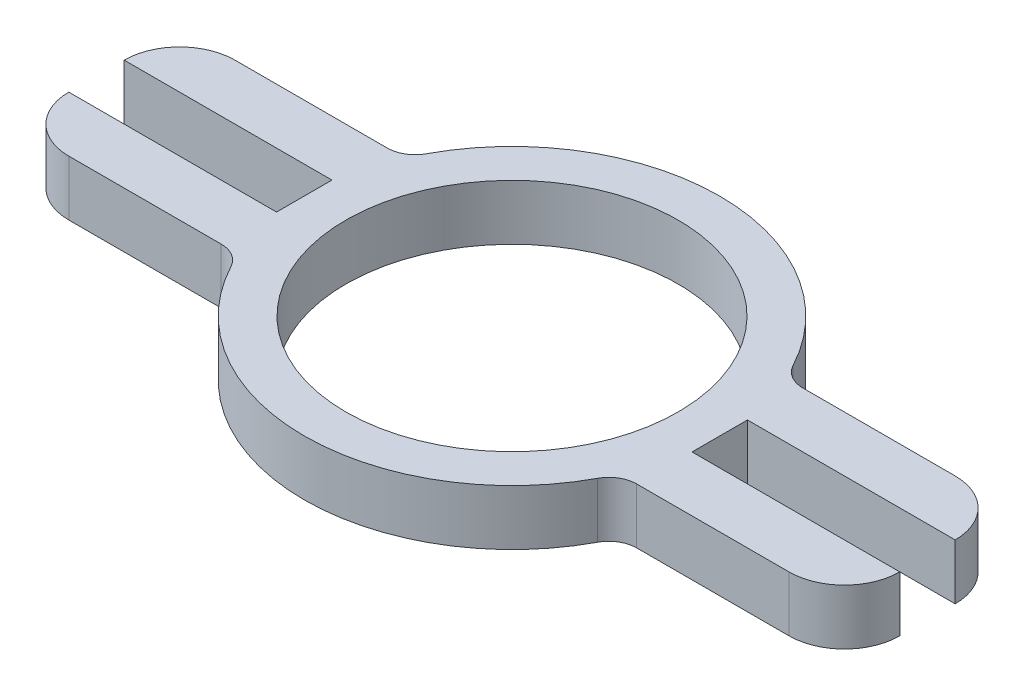
ISO-10303-21;
HEADER;
FILE_DESCRIPTION(('STEP AP214'),'2;1');
FILE_NAME('part.step','',(''),(''),'','','');
FILE_SCHEMA(('AUTOMOTIVE_DESIGN { 1 0 10303 214 1 1 1 1 }'));
ENDSEC;
DATA;
#1=APPLICATION_CONTEXT('core data for automotive mechanical design processes');
#2=APPLICATION_PROTOCOL_DEFINITION('international standard','automotive_design',2000,#1);
#3=PRODUCT_CONTEXT('',#1,'mechanical');
#4=PRODUCT('Part','Part','',(#3));
#5=PRODUCT_RELATED_PRODUCT_CATEGORY('part','',(#4));
#6=PRODUCT_DEFINITION_FORMATION('','',#4);
#7=PRODUCT_DEFINITION_CONTEXT('part definition',#1,'design');
#8=PRODUCT_DEFINITION('design','',#6,#7);
#9=PRODUCT_DEFINITION_SHAPE('','',#8);
#10=(LENGTH_UNIT() NAMED_UNIT(*) SI_UNIT(.MILLI.,.METRE.));
#11=(NAMED_UNIT(*) PLANE_ANGLE_UNIT() SI_UNIT($,.RADIAN.));
#12=(NAMED_UNIT(*) SI_UNIT($,.STERADIAN.) SOLID_ANGLE_UNIT());
#13=UNCERTAINTY_MEASURE_WITH_UNIT(LENGTH_MEASURE(1.E-05),#10,'distance_accuracy_value','');
#14=(GEOMETRIC_REPRESENTATION_CONTEXT(3) GLOBAL_UNCERTAINTY_ASSIGNED_CONTEXT((#13)) GLOBAL_UNIT_ASSIGNED_CONTEXT((#10,
#11,#12)) REPRESENTATION_CONTEXT('',''));
#15=CARTESIAN_POINT('',(0.,0.,0.));
#16=DIRECTION('',(0.,0.,1.));
#17=DIRECTION('',(1.,0.,0.));
#18=AXIS2_PLACEMENT_3D('',#15,#16,#17);
#19=CARTESIAN_POINT('',(0.,20.,0.));
#20=DIRECTION('',(0.,-1.,0.));
#21=DIRECTION('',(0.,0.,-1.));
#22=AXIS2_PLACEMENT_3D('',#19,#20,#21);
#23=CYLINDRICAL_SURFACE('',#22,75.);
#24=CARTESIAN_POINT('',(0.,20.,0.));
#25=DIRECTION('',(0.,1.,0.));
#26=DIRECTION('',(0.,0.,1.));
#27=AXIS2_PLACEMENT_3D('',#24,#25,#26);
#28=CIRCLE('',#27,75.);
#29=CARTESIAN_POINT('',(66.1764705882353,20.,-35.2941176470588));
#30=VERTEX_POINT('',#29);
#31=CARTESIAN_POINT('',(-66.1764705882353,20.,-35.2941176470588));
#32=VERTEX_POINT('',#31);
#33=EDGE_CURVE('E287',#30,#32,#28,.T.);
#34=ORIENTED_EDGE('',*,*,#33,.F.);
#35=DIRECTION('',(0.,-1.,0.));
#36=VECTOR('',#35,1.);
#37=CARTESIAN_POINT('',(66.1764705882353,20.,-35.2941176470588));
#38=LINE('',#37,#36);
#39=CARTESIAN_POINT('',(66.1764705882353,0.,-35.2941176470588));
#40=VERTEX_POINT('',#39);
#41=EDGE_CURVE('E333',#30,#40,#38,.T.);
#42=ORIENTED_EDGE('',*,*,#41,.T.);
#43=CARTESIAN_POINT('',(0.,0.,0.));
#44=DIRECTION('',(0.,1.,0.));
#45=DIRECTION('',(0.,0.,1.));
#46=AXIS2_PLACEMENT_3D('',#43,#44,#45);
#47=CIRCLE('',#46,75.);
#48=CARTESIAN_POINT('',(-66.1764705882353,0.,-35.2941176470588));
#49=VERTEX_POINT('',#48);
#50=EDGE_CURVE('E280',#40,#49,#47,.T.);
#51=ORIENTED_EDGE('',*,*,#50,.T.);
#52=DIRECTION('',(0.,-1.,0.));
#53=VECTOR('',#52,1.);
#54=CARTESIAN_POINT('',(-66.1764705882353,20.,-35.2941176470588));
#55=LINE('',#54,#53);
#56=EDGE_CURVE('E330',#49,#32,#55,.F.);
#57=ORIENTED_EDGE('',*,*,#56,.T.);
#58=EDGE_LOOP('',(#34,#42,#51,#57));
#59=FACE_BOUND('',#58,.T.);
#60=ADVANCED_FACE('F45',(#59),#23,.T.);
#61=CARTESIAN_POINT('',(0.,20.,0.));
#62=DIRECTION('',(0.,-1.,0.));
#63=DIRECTION('',(0.,0.,-1.));
#64=AXIS2_PLACEMENT_3D('',#61,#62,#63);
#65=CYLINDRICAL_SURFACE('',#64,75.);
#66=CARTESIAN_POINT('',(0.,20.,0.));
#67=DIRECTION('',(0.,1.,0.));
#68=DIRECTION('',(0.,0.,1.));
#69=AXIS2_PLACEMENT_3D('',#66,#67,#68);
#70=CIRCLE('',#69,75.);
#71=CARTESIAN_POINT('',(-66.1764705882353,20.,35.2941176470588));
#72=VERTEX_POINT('',#71);
#73=CARTESIAN_POINT('',(66.1764705882353,20.,35.2941176470588));
#74=VERTEX_POINT('',#73);
#75=EDGE_CURVE('E291',#72,#74,#70,.T.);
#76=ORIENTED_EDGE('',*,*,#75,.F.);
#77=DIRECTION('',(0.,-1.,0.));
#78=VECTOR('',#77,1.);
#79=CARTESIAN_POINT('',(-66.1764705882353,20.,35.2941176470588));
#80=LINE('',#79,#78);
#81=CARTESIAN_POINT('',(-66.1764705882353,0.,35.2941176470588));
#82=VERTEX_POINT('',#81);
#83=EDGE_CURVE('E319',#72,#82,#80,.T.);
#84=ORIENTED_EDGE('',*,*,#83,.T.);
#85=CARTESIAN_POINT('',(0.,0.,0.));
#86=DIRECTION('',(0.,1.,0.));
#87=DIRECTION('',(0.,0.,1.));
#88=AXIS2_PLACEMENT_3D('',#85,#86,#87);
#89=CIRCLE('',#88,75.);
#90=CARTESIAN_POINT('',(66.1764705882353,0.,35.2941176470588));
#91=VERTEX_POINT('',#90);
#92=EDGE_CURVE('E307',#82,#91,#89,.T.);
#93=ORIENTED_EDGE('',*,*,#92,.T.);
#94=DIRECTION('',(0.,-1.,0.));
#95=VECTOR('',#94,1.);
#96=CARTESIAN_POINT('',(66.1764705882353,20.,35.2941176470588));
#97=LINE('',#96,#95);
#98=EDGE_CURVE('E303',#91,#74,#97,.F.);
#99=ORIENTED_EDGE('',*,*,#98,.T.);
#100=EDGE_LOOP('',(#76,#84,#93,#99));
#101=FACE_BOUND('',#100,.T.);
#102=ADVANCED_FACE('F449',(#101),#65,.T.);
#103=CARTESIAN_POINT('',(150.,20.,30.));
#104=DIRECTION('',(0.,0.,-1.));
#105=DIRECTION('',(-1.,0.,0.));
#106=AXIS2_PLACEMENT_3D('',#103,#104,#105);
#107=PLANE('',#106);
#108=DIRECTION('',(1.,0.,0.));
#109=VECTOR('',#108,1.);
#110=CARTESIAN_POINT('',(150.,0.,30.));
#111=LINE('',#110,#109);
#112=CARTESIAN_POINT('',(75.,0.,30.));
#113=VERTEX_POINT('',#112);
#114=CARTESIAN_POINT('',(130.,0.,30.));
#115=VERTEX_POINT('',#114);
#116=EDGE_CURVE('E311',#113,#115,#111,.T.);
#117=ORIENTED_EDGE('',*,*,#116,.T.);
#118=DIRECTION('',(0.,-1.,0.));
#119=VECTOR('',#118,1.);
#120=CARTESIAN_POINT('',(130.,20.,30.));
#121=LINE('',#120,#119);
#122=CARTESIAN_POINT('',(130.,20.,30.));
#123=VERTEX_POINT('',#122);
#124=EDGE_CURVE('E11',#115,#123,#121,.F.);
#125=ORIENTED_EDGE('',*,*,#124,.T.);
#126=DIRECTION('',(1.,0.,0.));
#127=VECTOR('',#126,1.);
#128=CARTESIAN_POINT('',(150.,20.,30.));
#129=LINE('',#128,#127);
#130=CARTESIAN_POINT('',(75.,20.,30.));
#131=VERTEX_POINT('',#130);
#132=EDGE_CURVE('E296',#131,#123,#129,.T.);
#133=ORIENTED_EDGE('',*,*,#132,.F.);
#134=DIRECTION('',(0.,1.,0.));
#135=VECTOR('',#134,1.);
#136=CARTESIAN_POINT('',(75.,0.,30.));
#137=LINE('',#136,#135);
#138=EDGE_CURVE('E326',#131,#113,#137,.F.);
#139=ORIENTED_EDGE('',*,*,#138,.T.);
#140=EDGE_LOOP('',(#117,#125,#133,#139));
#141=FACE_BOUND('',#140,.T.);
#142=ADVANCED_FACE('F458',(#141),#107,.F.);
#143=CARTESIAN_POINT('',(68.7386354243376,20.,-30.));
#144=DIRECTION('',(0.,0.,1.));
#145=DIRECTION('',(1.,0.,0.));
#146=AXIS2_PLACEMENT_3D('',#143,#144,#145);
#147=PLANE('',#146);
#148=DIRECTION('',(-1.,0.,0.));
#149=VECTOR('',#148,1.);
#150=CARTESIAN_POINT('',(68.7386354243376,20.,-30.));
#151=LINE('',#150,#149);
#152=CARTESIAN_POINT('',(130.,20.,-30.));
#153=VERTEX_POINT('',#152);
#154=CARTESIAN_POINT('',(75.,20.,-30.));
#155=VERTEX_POINT('',#154);
#156=EDGE_CURVE('E300',#153,#155,#151,.T.);
#157=ORIENTED_EDGE('',*,*,#156,.F.);
#158=DIRECTION('',(0.,-1.,0.));
#159=VECTOR('',#158,1.);
#160=CARTESIAN_POINT('',(130.,20.,-30.));
#161=LINE('',#160,#159);
#162=CARTESIAN_POINT('',(130.,0.,-30.));
#163=VERTEX_POINT('',#162);
#164=EDGE_CURVE('E54',#153,#163,#161,.T.);
#165=ORIENTED_EDGE('',*,*,#164,.T.);
#166=DIRECTION('',(-1.,0.,0.));
#167=VECTOR('',#166,1.);
#168=CARTESIAN_POINT('',(68.7386354243376,0.,-30.));
#169=LINE('',#168,#167);
#170=CARTESIAN_POINT('',(75.,0.,-30.));
#171=VERTEX_POINT('',#170);
#172=EDGE_CURVE('E292',#163,#171,#169,.T.);
#173=ORIENTED_EDGE('',*,*,#172,.T.);
#174=DIRECTION('',(0.,1.,0.));
#175=VECTOR('',#174,1.);
#176=CARTESIAN_POINT('',(75.,20.,-30.));
#177=LINE('',#176,#175);
#178=EDGE_CURVE('E337',#171,#155,#177,.T.);
#179=ORIENTED_EDGE('',*,*,#178,.T.);
#180=EDGE_LOOP('',(#157,#165,#173,#179));
#181=FACE_BOUND('',#180,.T.);
#182=ADVANCED_FACE('F403',(#181),#147,.F.);
#183=CARTESIAN_POINT('',(0.,20.,0.));
#184=DIRECTION('',(0.,1.,0.));
#185=DIRECTION('',(0.,0.,1.));
#186=AXIS2_PLACEMENT_3D('',#183,#184,#185);
#187=PLANE('',#186);
#188=DIRECTION('',(-1.,0.,0.));
#189=VECTOR('',#188,1.);
#190=CARTESIAN_POINT('',(-150.,20.,10.));
#191=LINE('',#190,#189);
#192=CARTESIAN_POINT('',(-75.,20.,10.));
#193=VERTEX_POINT('',#192);
#194=CARTESIAN_POINT('',(-150.,20.,10.));
#195=VERTEX_POINT('',#194);
#196=EDGE_CURVE('E197',#193,#195,#191,.T.);
#197=ORIENTED_EDGE('',*,*,#196,.T.);
#198=CARTESIAN_POINT('',(-130.,20.,10.));
#199=DIRECTION('',(0.,1.,0.));
#200=DIRECTION('',(0.,0.,1.));
#201=AXIS2_PLACEMENT_3D('',#198,#199,#200);
#202=CIRCLE('',#201,20.);
#203=CARTESIAN_POINT('',(-130.,20.,30.));
#204=VERTEX_POINT('',#203);
#205=EDGE_CURVE('E394',#195,#204,#202,.T.);
#206=ORIENTED_EDGE('',*,*,#205,.T.);
#207=DIRECTION('',(-1.,0.,0.));
#208=VECTOR('',#207,1.);
#209=CARTESIAN_POINT('',(-150.,20.,30.));
#210=LINE('',#209,#208);
#211=CARTESIAN_POINT('',(-75.,20.,30.));
#212=VERTEX_POINT('',#211);
#213=EDGE_CURVE('E231',#212,#204,#210,.T.);
#214=ORIENTED_EDGE('',*,*,#213,.F.);
#215=CARTESIAN_POINT('',(-75.,20.,40.));
#216=DIRECTION('',(0.,1.,0.));
#217=DIRECTION('',(0.,0.,1.));
#218=AXIS2_PLACEMENT_3D('',#215,#216,#217);
#219=CIRCLE('',#218,10.);
#220=EDGE_CURVE('E348',#212,#72,#219,.F.);
#221=ORIENTED_EDGE('',*,*,#220,.T.);
#222=ORIENTED_EDGE('',*,*,#75,.T.);
#223=CARTESIAN_POINT('',(75.,20.,40.));
#224=DIRECTION('',(0.,1.,0.));
#225=DIRECTION('',(0.,0.,1.));
#226=AXIS2_PLACEMENT_3D('',#223,#224,#225);
#227=CIRCLE('',#226,10.);
#228=EDGE_CURVE('E354',#74,#131,#227,.F.);
#229=ORIENTED_EDGE('',*,*,#228,.T.);
#230=ORIENTED_EDGE('',*,*,#132,.T.);
#231=CARTESIAN_POINT('',(130.,20.,9.99999999999999));
#232=DIRECTION('',(0.,1.,0.));
#233=DIRECTION('',(0.,0.,1.));
#234=AXIS2_PLACEMENT_3D('',#231,#232,#233);
#235=CIRCLE('',#234,20.);
#236=CARTESIAN_POINT('',(150.,20.,10.));
#237=VERTEX_POINT('',#236);
#238=EDGE_CURVE('E387',#123,#237,#235,.T.);
#239=ORIENTED_EDGE('',*,*,#238,.T.);
#240=DIRECTION('',(1.,0.,0.));
#241=VECTOR('',#240,1.);
#242=CARTESIAN_POINT('',(150.,20.,10.));
#243=LINE('',#242,#241);
#244=CARTESIAN_POINT('',(75.,20.,10.));
#245=VERTEX_POINT('',#244);
#246=EDGE_CURVE('E257',#245,#237,#243,.T.);
#247=ORIENTED_EDGE('',*,*,#246,.F.);
#248=DIRECTION('',(0.,0.,1.));
#249=VECTOR('',#248,1.);
#250=CARTESIAN_POINT('',(75.,20.,10.));
#251=LINE('',#250,#249);
#252=CARTESIAN_POINT('',(75.,20.,-10.));
#253=VERTEX_POINT('',#252);
#254=EDGE_CURVE('E253',#253,#245,#251,.T.);
#255=ORIENTED_EDGE('',*,*,#254,.F.);
#256=DIRECTION('',(-1.,0.,0.));
#257=VECTOR('',#256,1.);
#258=CARTESIAN_POINT('',(75.,20.,-10.));
#259=LINE('',#258,#257);
#260=CARTESIAN_POINT('',(150.,20.,-10.));
#261=VERTEX_POINT('',#260);
#262=EDGE_CURVE('E262',#261,#253,#259,.T.);
#263=ORIENTED_EDGE('',*,*,#262,.F.);
#264=CARTESIAN_POINT('',(130.,20.,-10.));
#265=DIRECTION('',(0.,1.,0.));
#266=DIRECTION('',(0.,0.,1.));
#267=AXIS2_PLACEMENT_3D('',#264,#265,#266);
#268=CIRCLE('',#267,20.);
#269=EDGE_CURVE('E69',#261,#153,#268,.T.);
#270=ORIENTED_EDGE('',*,*,#269,.T.);
#271=ORIENTED_EDGE('',*,*,#156,.T.);
#272=CARTESIAN_POINT('',(75.,20.,-40.));
#273=DIRECTION('',(0.,1.,0.));
#274=DIRECTION('',(0.,0.,1.));
#275=AXIS2_PLACEMENT_3D('',#272,#273,#274);
#276=CIRCLE('',#275,10.);
#277=EDGE_CURVE('E361',#155,#30,#276,.F.);
#278=ORIENTED_EDGE('',*,*,#277,.T.);
#279=ORIENTED_EDGE('',*,*,#33,.T.);
#280=CARTESIAN_POINT('',(-75.,20.,-40.));
#281=DIRECTION('',(0.,1.,0.));
#282=DIRECTION('',(0.,0.,1.));
#283=AXIS2_PLACEMENT_3D('',#280,#281,#282);
#284=CIRCLE('',#283,10.);
#285=CARTESIAN_POINT('',(-75.,20.,-30.));
#286=VERTEX_POINT('',#285);
#287=EDGE_CURVE('E367',#32,#286,#284,.F.);
#288=ORIENTED_EDGE('',*,*,#287,.T.);
#289=DIRECTION('',(1.,0.,0.));
#290=VECTOR('',#289,1.);
#291=CARTESIAN_POINT('',(-68.7386354243376,20.,-30.));
#292=LINE('',#291,#290);
#293=CARTESIAN_POINT('',(-130.,20.,-30.));
#294=VERTEX_POINT('',#293);
#295=EDGE_CURVE('E228',#294,#286,#292,.T.);
#296=ORIENTED_EDGE('',*,*,#295,.F.);
#297=CARTESIAN_POINT('',(-130.,20.,-10.));
#298=DIRECTION('',(0.,1.,0.));
#299=DIRECTION('',(0.,0.,1.));
#300=AXIS2_PLACEMENT_3D('',#297,#298,#299);
#301=CIRCLE('',#300,20.);
#302=CARTESIAN_POINT('',(-150.,20.,-10.));
#303=VERTEX_POINT('',#302);
#304=EDGE_CURVE('E211',#294,#303,#301,.T.);
#305=ORIENTED_EDGE('',*,*,#304,.T.);
#306=DIRECTION('',(1.,0.,0.));
#307=VECTOR('',#306,1.);
#308=CARTESIAN_POINT('',(-75.,20.,-10.));
#309=LINE('',#308,#307);
#310=CARTESIAN_POINT('',(-75.,20.,-10.));
#311=VERTEX_POINT('',#310);
#312=EDGE_CURVE('E189',#303,#311,#309,.T.);
#313=ORIENTED_EDGE('',*,*,#312,.T.);
#314=DIRECTION('',(0.,0.,1.));
#315=VECTOR('',#314,1.);
#316=CARTESIAN_POINT('',(-75.,20.,10.));
#317=LINE('',#316,#315);
#318=EDGE_CURVE('E200',#311,#193,#317,.T.);
#319=ORIENTED_EDGE('',*,*,#318,.T.);
#320=EDGE_LOOP('',(#197,#206,#214,#221,#222,#229,#230,#239,#247,#255,#263,#270,#271,#278,#279,
#288,#296,#305,#313,#319));
#321=FACE_BOUND('',#320,.T.);
#322=CARTESIAN_POINT('',(0.,20.,0.));
#323=DIRECTION('',(0.,1.,0.));
#324=DIRECTION('',(0.,0.,1.));
#325=AXIS2_PLACEMENT_3D('',#322,#323,#324);
#326=CIRCLE('',#325,60.);
#327=CARTESIAN_POINT('',(0.,20.,60.));
#328=VERTEX_POINT('',#327);
#329=EDGE_CURVE('E258',#328,#328,#326,.T.);
#330=ORIENTED_EDGE('',*,*,#329,.F.);
#331=EDGE_LOOP('',(#330));
#332=FACE_BOUND('',#331,.T.);
#333=ADVANCED_FACE('F208',(#321,#332),#187,.T.);
#334=CARTESIAN_POINT('',(0.,0.,0.));
#335=DIRECTION('',(0.,1.,0.));
#336=DIRECTION('',(0.,0.,1.));
#337=AXIS2_PLACEMENT_3D('',#334,#335,#336);
#338=PLANE('',#337);
#339=DIRECTION('',(-1.,0.,0.));
#340=VECTOR('',#339,1.);
#341=CARTESIAN_POINT('',(-150.,0.,30.));
#342=LINE('',#341,#340);
#343=CARTESIAN_POINT('',(-75.,0.,30.));
#344=VERTEX_POINT('',#343);
#345=CARTESIAN_POINT('',(-130.,0.,30.));
#346=VERTEX_POINT('',#345);
#347=EDGE_CURVE('E232',#344,#346,#342,.T.);
#348=ORIENTED_EDGE('',*,*,#347,.T.);
#349=CARTESIAN_POINT('',(-130.,0.,10.));
#350=DIRECTION('',(0.,1.,0.));
#351=DIRECTION('',(0.,0.,1.));
#352=AXIS2_PLACEMENT_3D('',#349,#350,#351);
#353=CIRCLE('',#352,20.);
#354=CARTESIAN_POINT('',(-150.,0.,10.));
#355=VERTEX_POINT('',#354);
#356=EDGE_CURVE('E384',#346,#355,#353,.F.);
#357=ORIENTED_EDGE('',*,*,#356,.T.);
#358=DIRECTION('',(1.,0.,0.));
#359=VECTOR('',#358,1.);
#360=CARTESIAN_POINT('',(-150.,0.,10.));
#361=LINE('',#360,#359);
#362=CARTESIAN_POINT('',(-75.,0.,10.));
#363=VERTEX_POINT('',#362);
#364=EDGE_CURVE('E227',#355,#363,#361,.T.);
#365=ORIENTED_EDGE('',*,*,#364,.T.);
#366=DIRECTION('',(0.,0.,-1.));
#367=VECTOR('',#366,1.);
#368=CARTESIAN_POINT('',(-75.,0.,10.));
#369=LINE('',#368,#367);
#370=CARTESIAN_POINT('',(-75.,0.,-10.));
#371=VERTEX_POINT('',#370);
#372=EDGE_CURVE('E240',#363,#371,#369,.T.);
#373=ORIENTED_EDGE('',*,*,#372,.T.);
#374=DIRECTION('',(-1.,0.,0.));
#375=VECTOR('',#374,1.);
#376=CARTESIAN_POINT('',(-75.,0.,-10.));
#377=LINE('',#376,#375);
#378=CARTESIAN_POINT('',(-150.,0.,-10.));
#379=VERTEX_POINT('',#378);
#380=EDGE_CURVE('E192',#371,#379,#377,.T.);
#381=ORIENTED_EDGE('',*,*,#380,.T.);
#382=CARTESIAN_POINT('',(-130.,0.,-10.));
#383=DIRECTION('',(0.,1.,0.));
#384=DIRECTION('',(0.,0.,1.));
#385=AXIS2_PLACEMENT_3D('',#382,#383,#384);
#386=CIRCLE('',#385,20.);
#387=CARTESIAN_POINT('',(-130.,0.,-30.));
#388=VERTEX_POINT('',#387);
#389=EDGE_CURVE('E381',#379,#388,#386,.F.);
#390=ORIENTED_EDGE('',*,*,#389,.T.);
#391=DIRECTION('',(1.,0.,0.));
#392=VECTOR('',#391,1.);
#393=CARTESIAN_POINT('',(-68.7386354243376,0.,-30.));
#394=LINE('',#393,#392);
#395=CARTESIAN_POINT('',(-75.,0.,-30.));
#396=VERTEX_POINT('',#395);
#397=EDGE_CURVE('E237',#388,#396,#394,.T.);
#398=ORIENTED_EDGE('',*,*,#397,.T.);
#399=CARTESIAN_POINT('',(-75.,0.,-40.));
#400=DIRECTION('',(0.,1.,0.));
#401=DIRECTION('',(0.,0.,1.));
#402=AXIS2_PLACEMENT_3D('',#399,#400,#401);
#403=CIRCLE('',#402,10.);
#404=EDGE_CURVE('E364',#396,#49,#403,.T.);
#405=ORIENTED_EDGE('',*,*,#404,.T.);
#406=ORIENTED_EDGE('',*,*,#50,.F.);
#407=CARTESIAN_POINT('',(75.,0.,-40.));
#408=DIRECTION('',(0.,1.,0.));
#409=DIRECTION('',(0.,0.,1.));
#410=AXIS2_PLACEMENT_3D('',#407,#408,#409);
#411=CIRCLE('',#410,10.);
#412=EDGE_CURVE('E357',#40,#171,#411,.T.);
#413=ORIENTED_EDGE('',*,*,#412,.T.);
#414=ORIENTED_EDGE('',*,*,#172,.F.);
#415=CARTESIAN_POINT('',(130.,0.,-10.));
#416=DIRECTION('',(0.,1.,0.));
#417=DIRECTION('',(0.,0.,1.));
#418=AXIS2_PLACEMENT_3D('',#415,#416,#417);
#419=CIRCLE('',#418,20.);
#420=CARTESIAN_POINT('',(150.,0.,-10.));
#421=VERTEX_POINT('',#420);
#422=EDGE_CURVE('E378',#163,#421,#419,.F.);
#423=ORIENTED_EDGE('',*,*,#422,.T.);
#424=DIRECTION('',(1.,0.,0.));
#425=VECTOR('',#424,1.);
#426=CARTESIAN_POINT('',(75.,0.,-10.));
#427=LINE('',#426,#425);
#428=CARTESIAN_POINT('',(75.,0.,-10.));
#429=VERTEX_POINT('',#428);
#430=EDGE_CURVE('E244',#429,#421,#427,.T.);
#431=ORIENTED_EDGE('',*,*,#430,.F.);
#432=DIRECTION('',(0.,0.,-1.));
#433=VECTOR('',#432,1.);
#434=CARTESIAN_POINT('',(75.,0.,10.));
#435=LINE('',#434,#433);
#436=CARTESIAN_POINT('',(75.,0.,10.));
#437=VERTEX_POINT('',#436);
#438=EDGE_CURVE('E248',#437,#429,#435,.T.);
#439=ORIENTED_EDGE('',*,*,#438,.F.);
#440=DIRECTION('',(-1.,0.,0.));
#441=VECTOR('',#440,1.);
#442=CARTESIAN_POINT('',(150.,0.,10.));
#443=LINE('',#442,#441);
#444=CARTESIAN_POINT('',(150.,0.,10.));
#445=VERTEX_POINT('',#444);
#446=EDGE_CURVE('E252',#445,#437,#443,.T.);
#447=ORIENTED_EDGE('',*,*,#446,.F.);
#448=CARTESIAN_POINT('',(130.,0.,9.99999999999999));
#449=DIRECTION('',(0.,1.,0.));
#450=DIRECTION('',(0.,0.,1.));
#451=AXIS2_PLACEMENT_3D('',#448,#449,#450);
#452=CIRCLE('',#451,20.);
#453=EDGE_CURVE('E375',#445,#115,#452,.F.);
#454=ORIENTED_EDGE('',*,*,#453,.T.);
#455=ORIENTED_EDGE('',*,*,#116,.F.);
#456=CARTESIAN_POINT('',(75.,0.,40.));
#457=DIRECTION('',(0.,1.,0.));
#458=DIRECTION('',(0.,0.,1.));
#459=AXIS2_PLACEMENT_3D('',#456,#457,#458);
#460=CIRCLE('',#459,10.);
#461=EDGE_CURVE('E351',#113,#91,#460,.T.);
#462=ORIENTED_EDGE('',*,*,#461,.T.);
#463=ORIENTED_EDGE('',*,*,#92,.F.);
#464=CARTESIAN_POINT('',(-75.,0.,40.));
#465=DIRECTION('',(0.,1.,0.));
#466=DIRECTION('',(0.,0.,1.));
#467=AXIS2_PLACEMENT_3D('',#464,#465,#466);
#468=CIRCLE('',#467,10.);
#469=EDGE_CURVE('E345',#82,#344,#468,.T.);
#470=ORIENTED_EDGE('',*,*,#469,.T.);
#471=EDGE_LOOP('',(#348,#357,#365,#373,#381,#390,#398,#405,#406,#413,#414,#423,#431,#439,#447,
#454,#455,#462,#463,#470));
#472=FACE_BOUND('',#471,.T.);
#473=CARTESIAN_POINT('',(0.,0.,0.));
#474=DIRECTION('',(0.,1.,0.));
#475=DIRECTION('',(0.,0.,1.));
#476=AXIS2_PLACEMENT_3D('',#473,#474,#475);
#477=CIRCLE('',#476,60.);
#478=CARTESIAN_POINT('',(0.,0.,60.));
#479=VERTEX_POINT('',#478);
#480=EDGE_CURVE('E236',#479,#479,#477,.F.);
#481=ORIENTED_EDGE('',*,*,#480,.F.);
#482=EDGE_LOOP('',(#481));
#483=FACE_BOUND('',#482,.T.);
#484=ADVANCED_FACE('F406',(#472,#483),#338,.F.);
#485=CARTESIAN_POINT('',(0.,-134.164078649987,0.));
#486=DIRECTION('',(0.,1.,0.));
#487=DIRECTION('',(0.,0.,1.));
#488=AXIS2_PLACEMENT_3D('',#485,#486,#487);
#489=CYLINDRICAL_SURFACE('',#488,60.);
#490=ORIENTED_EDGE('',*,*,#329,.T.);
#491=EDGE_LOOP('',(#490));
#492=FACE_BOUND('',#491,.T.);
#493=ORIENTED_EDGE('',*,*,#480,.T.);
#494=EDGE_LOOP('',(#493));
#495=FACE_BOUND('',#494,.T.);
#496=ADVANCED_FACE('F600',(#492,#495),#489,.F.);
#497=CARTESIAN_POINT('',(75.,-134.164078649987,10.));
#498=DIRECTION('',(-1.,0.,0.));
#499=DIRECTION('',(0.,0.,1.));
#500=AXIS2_PLACEMENT_3D('',#497,#498,#499);
#501=PLANE('',#500);
#502=ORIENTED_EDGE('',*,*,#438,.T.);
#503=DIRECTION('',(0.,1.,0.));
#504=VECTOR('',#503,1.);
#505=CARTESIAN_POINT('',(75.,-134.164078649987,-10.));
#506=LINE('',#505,#504);
#507=EDGE_CURVE('E249',#429,#253,#506,.T.);
#508=ORIENTED_EDGE('',*,*,#507,.T.);
#509=ORIENTED_EDGE('',*,*,#254,.T.);
#510=DIRECTION('',(0.,1.,0.));
#511=VECTOR('',#510,1.);
#512=CARTESIAN_POINT('',(75.,-134.164078649987,10.));
#513=LINE('',#512,#511);
#514=EDGE_CURVE('E266',#437,#245,#513,.T.);
#515=ORIENTED_EDGE('',*,*,#514,.F.);
#516=EDGE_LOOP('',(#502,#508,#509,#515));
#517=FACE_BOUND('',#516,.T.);
#518=ADVANCED_FACE('F471',(#517),#501,.F.);
#519=CARTESIAN_POINT('',(75.,-134.164078649987,-10.));
#520=DIRECTION('',(0.,0.,-1.));
#521=DIRECTION('',(-1.,0.,0.));
#522=AXIS2_PLACEMENT_3D('',#519,#520,#521);
#523=PLANE('',#522);
#524=ORIENTED_EDGE('',*,*,#430,.T.);
#525=DIRECTION('',(0.,1.,0.));
#526=VECTOR('',#525,1.);
#527=CARTESIAN_POINT('',(150.,-134.164078649987,-10.));
#528=LINE('',#527,#526);
#529=EDGE_CURVE('E269',#421,#261,#528,.T.);
#530=ORIENTED_EDGE('',*,*,#529,.T.);
#531=ORIENTED_EDGE('',*,*,#262,.T.);
#532=ORIENTED_EDGE('',*,*,#507,.F.);
#533=EDGE_LOOP('',(#524,#530,#531,#532));
#534=FACE_BOUND('',#533,.T.);
#535=ADVANCED_FACE('F474',(#534),#523,.F.);
#536=CARTESIAN_POINT('',(150.,-134.164078649987,10.));
#537=DIRECTION('',(0.,0.,1.));
#538=DIRECTION('',(1.,0.,0.));
#539=AXIS2_PLACEMENT_3D('',#536,#537,#538);
#540=PLANE('',#539);
#541=ORIENTED_EDGE('',*,*,#446,.T.);
#542=ORIENTED_EDGE('',*,*,#514,.T.);
#543=ORIENTED_EDGE('',*,*,#246,.T.);
#544=DIRECTION('',(0.,1.,0.));
#545=VECTOR('',#544,1.);
#546=CARTESIAN_POINT('',(150.,-134.164078649987,10.));
#547=LINE('',#546,#545);
#548=EDGE_CURVE('E272',#445,#237,#547,.T.);
#549=ORIENTED_EDGE('',*,*,#548,.F.);
#550=EDGE_LOOP('',(#541,#542,#543,#549));
#551=FACE_BOUND('',#550,.T.);
#552=ADVANCED_FACE('F466',(#551),#540,.F.);
#553=CARTESIAN_POINT('',(-68.7386354243376,20.,-30.));
#554=DIRECTION('',(0.,0.,-1.));
#555=DIRECTION('',(-1.,0.,0.));
#556=AXIS2_PLACEMENT_3D('',#553,#554,#555);
#557=PLANE('',#556);
#558=ORIENTED_EDGE('',*,*,#397,.F.);
#559=DIRECTION('',(0.,-1.,0.));
#560=VECTOR('',#559,1.);
#561=CARTESIAN_POINT('',(-130.,20.,-30.));
#562=LINE('',#561,#560);
#563=EDGE_CURVE('E61',#388,#294,#562,.F.);
#564=ORIENTED_EDGE('',*,*,#563,.T.);
#565=ORIENTED_EDGE('',*,*,#295,.T.);
#566=DIRECTION('',(0.,-1.,0.));
#567=VECTOR('',#566,1.);
#568=CARTESIAN_POINT('',(-75.,20.,-30.));
#569=LINE('',#568,#567);
#570=EDGE_CURVE('E341',#286,#396,#569,.T.);
#571=ORIENTED_EDGE('',*,*,#570,.T.);
#572=EDGE_LOOP('',(#558,#564,#565,#571));
#573=FACE_BOUND('',#572,.T.);
#574=ADVANCED_FACE('F570',(#573),#557,.T.);
#575=CARTESIAN_POINT('',(-150.,20.,30.));
#576=DIRECTION('',(0.,0.,1.));
#577=DIRECTION('',(1.,0.,0.));
#578=AXIS2_PLACEMENT_3D('',#575,#576,#577);
#579=PLANE('',#578);
#580=ORIENTED_EDGE('',*,*,#213,.T.);
#581=DIRECTION('',(0.,-1.,0.));
#582=VECTOR('',#581,1.);
#583=CARTESIAN_POINT('',(-130.,20.,30.));
#584=LINE('',#583,#582);
#585=EDGE_CURVE('E371',#204,#346,#584,.T.);
#586=ORIENTED_EDGE('',*,*,#585,.T.);
#587=ORIENTED_EDGE('',*,*,#347,.F.);
#588=DIRECTION('',(0.,-1.,0.));
#589=VECTOR('',#588,1.);
#590=CARTESIAN_POINT('',(-75.,20.,30.));
#591=LINE('',#590,#589);
#592=EDGE_CURVE('E323',#344,#212,#591,.F.);
#593=ORIENTED_EDGE('',*,*,#592,.T.);
#594=EDGE_LOOP('',(#580,#586,#587,#593));
#595=FACE_BOUND('',#594,.T.);
#596=ADVANCED_FACE('F440',(#595),#579,.T.);
#597=CARTESIAN_POINT('',(-75.,-134.164078649987,-10.));
#598=DIRECTION('',(0.,0.,1.));
#599=DIRECTION('',(1.,0.,0.));
#600=AXIS2_PLACEMENT_3D('',#597,#598,#599);
#601=PLANE('',#600);
#602=DIRECTION('',(0.,1.,0.));
#603=VECTOR('',#602,1.);
#604=CARTESIAN_POINT('',(-75.,-134.164078649987,-10.));
#605=LINE('',#604,#603);
#606=EDGE_CURVE('E184',#371,#311,#605,.T.);
#607=ORIENTED_EDGE('',*,*,#606,.T.);
#608=ORIENTED_EDGE('',*,*,#312,.F.);
#609=DIRECTION('',(0.,1.,0.));
#610=VECTOR('',#609,1.);
#611=CARTESIAN_POINT('',(-150.,-134.164078649987,-10.));
#612=LINE('',#611,#610);
#613=EDGE_CURVE('E196',#379,#303,#612,.T.);
#614=ORIENTED_EDGE('',*,*,#613,.F.);
#615=ORIENTED_EDGE('',*,*,#380,.F.);
#616=EDGE_LOOP('',(#607,#608,#614,#615));
#617=FACE_BOUND('',#616,.T.);
#618=ADVANCED_FACE('F186',(#617),#601,.T.);
#619=CARTESIAN_POINT('',(-150.,-134.164078649987,10.));
#620=DIRECTION('',(0.,0.,-1.));
#621=DIRECTION('',(-1.,0.,0.));
#622=AXIS2_PLACEMENT_3D('',#619,#620,#621);
#623=PLANE('',#622);
#624=DIRECTION('',(0.,1.,0.));
#625=VECTOR('',#624,1.);
#626=CARTESIAN_POINT('',(-150.,-134.164078649987,10.));
#627=LINE('',#626,#625);
#628=EDGE_CURVE('E220',#355,#195,#627,.T.);
#629=ORIENTED_EDGE('',*,*,#628,.T.);
#630=ORIENTED_EDGE('',*,*,#196,.F.);
#631=DIRECTION('',(0.,1.,0.));
#632=VECTOR('',#631,1.);
#633=CARTESIAN_POINT('',(-75.,-134.164078649987,10.));
#634=LINE('',#633,#632);
#635=EDGE_CURVE('E203',#363,#193,#634,.T.);
#636=ORIENTED_EDGE('',*,*,#635,.F.);
#637=ORIENTED_EDGE('',*,*,#364,.F.);
#638=EDGE_LOOP('',(#629,#630,#636,#637));
#639=FACE_BOUND('',#638,.T.);
#640=ADVANCED_FACE('F431',(#639),#623,.T.);
#641=CARTESIAN_POINT('',(-75.,-134.164078649987,10.));
#642=DIRECTION('',(-1.,0.,0.));
#643=DIRECTION('',(0.,0.,1.));
#644=AXIS2_PLACEMENT_3D('',#641,#642,#643);
#645=PLANE('',#644);
#646=ORIENTED_EDGE('',*,*,#635,.T.);
#647=ORIENTED_EDGE('',*,*,#318,.F.);
#648=ORIENTED_EDGE('',*,*,#606,.F.);
#649=ORIENTED_EDGE('',*,*,#372,.F.);
#650=EDGE_LOOP('',(#646,#647,#648,#649));
#651=FACE_BOUND('',#650,.T.);
#652=ADVANCED_FACE('F201',(#651),#645,.T.);
#653=CARTESIAN_POINT('',(-75.,20.,40.));
#654=DIRECTION('',(0.,-1.,0.));
#655=DIRECTION('',(0.,0.,-1.));
#656=AXIS2_PLACEMENT_3D('',#653,#654,#655);
#657=CYLINDRICAL_SURFACE('',#656,10.);
#658=ORIENTED_EDGE('',*,*,#220,.F.);
#659=ORIENTED_EDGE('',*,*,#592,.F.);
#660=ORIENTED_EDGE('',*,*,#469,.F.);
#661=ORIENTED_EDGE('',*,*,#83,.F.);
#662=EDGE_LOOP('',(#658,#659,#660,#661));
#663=FACE_BOUND('',#662,.T.);
#664=ADVANCED_FACE('F446',(#663),#657,.F.);
#665=CARTESIAN_POINT('',(75.,20.,40.));
#666=DIRECTION('',(0.,-1.,0.));
#667=DIRECTION('',(0.,0.,-1.));
#668=AXIS2_PLACEMENT_3D('',#665,#666,#667);
#669=CYLINDRICAL_SURFACE('',#668,10.);
#670=ORIENTED_EDGE('',*,*,#228,.F.);
#671=ORIENTED_EDGE('',*,*,#98,.F.);
#672=ORIENTED_EDGE('',*,*,#461,.F.);
#673=ORIENTED_EDGE('',*,*,#138,.F.);
#674=EDGE_LOOP('',(#670,#671,#672,#673));
#675=FACE_BOUND('',#674,.T.);
#676=ADVANCED_FACE('F455',(#675),#669,.F.);
#677=CARTESIAN_POINT('',(75.,20.,-40.));
#678=DIRECTION('',(0.,-1.,0.));
#679=DIRECTION('',(0.,0.,-1.));
#680=AXIS2_PLACEMENT_3D('',#677,#678,#679);
#681=CYLINDRICAL_SURFACE('',#680,10.);
#682=ORIENTED_EDGE('',*,*,#277,.F.);
#683=ORIENTED_EDGE('',*,*,#178,.F.);
#684=ORIENTED_EDGE('',*,*,#412,.F.);
#685=ORIENTED_EDGE('',*,*,#41,.F.);
#686=EDGE_LOOP('',(#682,#683,#684,#685));
#687=FACE_BOUND('',#686,.T.);
#688=ADVANCED_FACE('F414',(#687),#681,.F.);
#689=CARTESIAN_POINT('',(-75.,20.,-40.));
#690=DIRECTION('',(0.,-1.,0.));
#691=DIRECTION('',(0.,0.,-1.));
#692=AXIS2_PLACEMENT_3D('',#689,#690,#691);
#693=CYLINDRICAL_SURFACE('',#692,10.);
#694=ORIENTED_EDGE('',*,*,#287,.F.);
#695=ORIENTED_EDGE('',*,*,#56,.F.);
#696=ORIENTED_EDGE('',*,*,#404,.F.);
#697=ORIENTED_EDGE('',*,*,#570,.F.);
#698=EDGE_LOOP('',(#694,#695,#696,#697));
#699=FACE_BOUND('',#698,.T.);
#700=ADVANCED_FACE('F421',(#699),#693,.F.);
#701=CARTESIAN_POINT('',(-130.,20.,10.));
#702=DIRECTION('',(0.,-1.,0.));
#703=DIRECTION('',(0.,0.,-1.));
#704=AXIS2_PLACEMENT_3D('',#701,#702,#703);
#705=CYLINDRICAL_SURFACE('',#704,20.);
#706=ORIENTED_EDGE('',*,*,#205,.F.);
#707=ORIENTED_EDGE('',*,*,#628,.F.);
#708=ORIENTED_EDGE('',*,*,#356,.F.);
#709=ORIENTED_EDGE('',*,*,#585,.F.);
#710=EDGE_LOOP('',(#706,#707,#708,#709));
#711=FACE_BOUND('',#710,.T.);
#712=ADVANCED_FACE('F437',(#711),#705,.T.);
#713=CARTESIAN_POINT('',(-130.,20.,-10.));
#714=DIRECTION('',(0.,-1.,0.));
#715=DIRECTION('',(0.,0.,-1.));
#716=AXIS2_PLACEMENT_3D('',#713,#714,#715);
#717=CYLINDRICAL_SURFACE('',#716,20.);
#718=ORIENTED_EDGE('',*,*,#304,.F.);
#719=ORIENTED_EDGE('',*,*,#563,.F.);
#720=ORIENTED_EDGE('',*,*,#389,.F.);
#721=ORIENTED_EDGE('',*,*,#613,.T.);
#722=EDGE_LOOP('',(#718,#719,#720,#721));
#723=FACE_BOUND('',#722,.T.);
#724=ADVANCED_FACE('F424',(#723),#717,.T.);
#725=CARTESIAN_POINT('',(130.,20.,-10.));
#726=DIRECTION('',(0.,-1.,0.));
#727=DIRECTION('',(0.,0.,-1.));
#728=AXIS2_PLACEMENT_3D('',#725,#726,#727);
#729=CYLINDRICAL_SURFACE('',#728,20.);
#730=ORIENTED_EDGE('',*,*,#269,.F.);
#731=ORIENTED_EDGE('',*,*,#529,.F.);
#732=ORIENTED_EDGE('',*,*,#422,.F.);
#733=ORIENTED_EDGE('',*,*,#164,.F.);
#734=EDGE_LOOP('',(#730,#731,#732,#733));
#735=FACE_BOUND('',#734,.T.);
#736=ADVANCED_FACE('F476',(#735),#729,.T.);
#737=CARTESIAN_POINT('',(130.,20.,9.99999999999999));
#738=DIRECTION('',(0.,-1.,0.));
#739=DIRECTION('',(0.,0.,-1.));
#740=AXIS2_PLACEMENT_3D('',#737,#738,#739);
#741=CYLINDRICAL_SURFACE('',#740,20.);
#742=ORIENTED_EDGE('',*,*,#238,.F.);
#743=ORIENTED_EDGE('',*,*,#124,.F.);
#744=ORIENTED_EDGE('',*,*,#453,.F.);
#745=ORIENTED_EDGE('',*,*,#548,.T.);
#746=EDGE_LOOP('',(#742,#743,#744,#745));
#747=FACE_BOUND('',#746,.T.);
#748=ADVANCED_FACE('F47',(#747),#741,.T.);
#749=CLOSED_SHELL('',(#60,#102,#142,#182,#333,#484,#496,#518,#535,#552,#574,#596,#618,#640,#652,
#664,#676,#688,#700,#712,#724,#736,#748));
#750=MANIFOLD_SOLID_BREP('B2',#749);
#751=ADVANCED_BREP_SHAPE_REPRESENTATION('',(#18,#750),#14);
#752=SHAPE_DEFINITION_REPRESENTATION(#9,#751);
ENDSEC;
END-ISO-10303-21;
